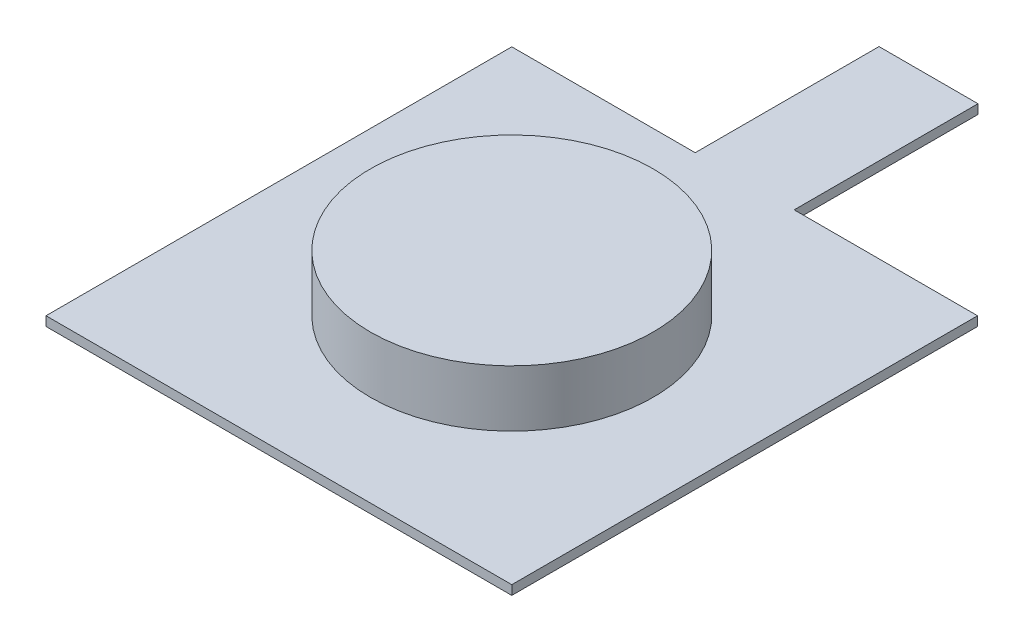
ISO-10303-21;
HEADER;
FILE_DESCRIPTION(('STEP AP214'),'2;1');
FILE_NAME('part.step','',(''),(''),'','','');
FILE_SCHEMA(('AUTOMOTIVE_DESIGN { 1 0 10303 214 1 1 1 1 }'));
ENDSEC;
DATA;
#1=APPLICATION_CONTEXT('core data for automotive mechanical design processes');
#2=APPLICATION_PROTOCOL_DEFINITION('international standard','automotive_design',2000,#1);
#3=PRODUCT_CONTEXT('',#1,'mechanical');
#4=PRODUCT('Part','Part','',(#3));
#5=PRODUCT_RELATED_PRODUCT_CATEGORY('part','',(#4));
#6=PRODUCT_DEFINITION_FORMATION('','',#4);
#7=PRODUCT_DEFINITION_CONTEXT('part definition',#1,'design');
#8=PRODUCT_DEFINITION('design','',#6,#7);
#9=PRODUCT_DEFINITION_SHAPE('','',#8);
#10=(LENGTH_UNIT() NAMED_UNIT(*) SI_UNIT(.MILLI.,.METRE.));
#11=(NAMED_UNIT(*) PLANE_ANGLE_UNIT() SI_UNIT($,.RADIAN.));
#12=(NAMED_UNIT(*) SI_UNIT($,.STERADIAN.) SOLID_ANGLE_UNIT());
#13=UNCERTAINTY_MEASURE_WITH_UNIT(LENGTH_MEASURE(1.E-05),#10,'distance_accuracy_value','');
#14=(GEOMETRIC_REPRESENTATION_CONTEXT(3) GLOBAL_UNCERTAINTY_ASSIGNED_CONTEXT((#13)) GLOBAL_UNIT_ASSIGNED_CONTEXT((#10,
#11,#12)) REPRESENTATION_CONTEXT('',''));
#15=CARTESIAN_POINT('',(0.,0.,0.));
#16=DIRECTION('',(0.,0.,1.));
#17=DIRECTION('',(1.,0.,0.));
#18=AXIS2_PLACEMENT_3D('',#15,#16,#17);
#19=CARTESIAN_POINT('',(0.,0.33,0.));
#20=DIRECTION('',(1.,0.,0.));
#21=DIRECTION('',(0.,0.,-1.));
#22=AXIS2_PLACEMENT_3D('',#19,#20,#21);
#23=PLANE('',#22);
#24=DIRECTION('',(0.,0.,1.));
#25=VECTOR('',#24,1.);
#26=CARTESIAN_POINT('',(0.,0.,0.));
#27=LINE('',#26,#25);
#28=CARTESIAN_POINT('',(0.,0.,-16.47));
#29=VERTEX_POINT('',#28);
#30=CARTESIAN_POINT('',(0.,0.,0.));
#31=VERTEX_POINT('',#30);
#32=EDGE_CURVE('E131',#29,#31,#27,.T.);
#33=ORIENTED_EDGE('',*,*,#32,.T.);
#34=DIRECTION('',(0.,-1.,0.));
#35=VECTOR('',#34,1.);
#36=CARTESIAN_POINT('',(0.,0.33,0.));
#37=LINE('',#36,#35);
#38=CARTESIAN_POINT('',(0.,0.33,0.));
#39=VERTEX_POINT('',#38);
#40=EDGE_CURVE('E36',#39,#31,#37,.T.);
#41=ORIENTED_EDGE('',*,*,#40,.F.);
#42=DIRECTION('',(0.,0.,1.));
#43=VECTOR('',#42,1.);
#44=CARTESIAN_POINT('',(0.,0.33,0.));
#45=LINE('',#44,#43);
#46=CARTESIAN_POINT('',(0.,0.33,-16.47));
#47=VERTEX_POINT('',#46);
#48=EDGE_CURVE('E146',#47,#39,#45,.T.);
#49=ORIENTED_EDGE('',*,*,#48,.F.);
#50=DIRECTION('',(0.,-1.,0.));
#51=VECTOR('',#50,1.);
#52=CARTESIAN_POINT('',(0.,0.33,-16.47));
#53=LINE('',#52,#51);
#54=EDGE_CURVE('E127',#47,#29,#53,.T.);
#55=ORIENTED_EDGE('',*,*,#54,.T.);
#56=EDGE_LOOP('',(#33,#41,#49,#55));
#57=FACE_BOUND('',#56,.T.);
#58=ADVANCED_FACE('F33',(#57),#23,.F.);
#59=CARTESIAN_POINT('',(0.,0.33,0.));
#60=DIRECTION('',(0.,0.,-1.));
#61=DIRECTION('',(-1.,0.,0.));
#62=AXIS2_PLACEMENT_3D('',#59,#60,#61);
#63=PLANE('',#62);
#64=DIRECTION('',(1.,0.,0.));
#65=VECTOR('',#64,1.);
#66=CARTESIAN_POINT('',(0.,0.,0.));
#67=LINE('',#66,#65);
#68=CARTESIAN_POINT('',(16.47,0.,0.));
#69=VERTEX_POINT('',#68);
#70=EDGE_CURVE('E134',#31,#69,#67,.T.);
#71=ORIENTED_EDGE('',*,*,#70,.T.);
#72=DIRECTION('',(0.,-1.,0.));
#73=VECTOR('',#72,1.);
#74=CARTESIAN_POINT('',(16.47,0.33,0.));
#75=LINE('',#74,#73);
#76=CARTESIAN_POINT('',(16.47,0.33,0.));
#77=VERTEX_POINT('',#76);
#78=EDGE_CURVE('E155',#77,#69,#75,.T.);
#79=ORIENTED_EDGE('',*,*,#78,.F.);
#80=DIRECTION('',(1.,0.,0.));
#81=VECTOR('',#80,1.);
#82=CARTESIAN_POINT('',(0.,0.33,0.));
#83=LINE('',#82,#81);
#84=EDGE_CURVE('E94',#39,#77,#83,.T.);
#85=ORIENTED_EDGE('',*,*,#84,.F.);
#86=ORIENTED_EDGE('',*,*,#40,.T.);
#87=EDGE_LOOP('',(#71,#79,#85,#86));
#88=FACE_BOUND('',#87,.T.);
#89=ADVANCED_FACE('F161',(#88),#63,.F.);
#90=CARTESIAN_POINT('',(16.47,0.33,0.));
#91=DIRECTION('',(-1.,0.,0.));
#92=DIRECTION('',(0.,0.,1.));
#93=AXIS2_PLACEMENT_3D('',#90,#91,#92);
#94=PLANE('',#93);
#95=DIRECTION('',(0.,0.,-1.));
#96=VECTOR('',#95,1.);
#97=CARTESIAN_POINT('',(16.47,0.,0.));
#98=LINE('',#97,#96);
#99=CARTESIAN_POINT('',(16.47,0.,-16.47));
#100=VERTEX_POINT('',#99);
#101=EDGE_CURVE('E137',#69,#100,#98,.T.);
#102=ORIENTED_EDGE('',*,*,#101,.T.);
#103=DIRECTION('',(0.,-1.,0.));
#104=VECTOR('',#103,1.);
#105=CARTESIAN_POINT('',(16.47,0.33,-16.47));
#106=LINE('',#105,#104);
#107=CARTESIAN_POINT('',(16.47,0.33,-16.47));
#108=VERTEX_POINT('',#107);
#109=EDGE_CURVE('E153',#108,#100,#106,.T.);
#110=ORIENTED_EDGE('',*,*,#109,.F.);
#111=DIRECTION('',(0.,0.,-1.));
#112=VECTOR('',#111,1.);
#113=CARTESIAN_POINT('',(16.47,0.33,0.));
#114=LINE('',#113,#112);
#115=EDGE_CURVE('E176',#77,#108,#114,.T.);
#116=ORIENTED_EDGE('',*,*,#115,.F.);
#117=ORIENTED_EDGE('',*,*,#78,.T.);
#118=EDGE_LOOP('',(#102,#110,#116,#117));
#119=FACE_BOUND('',#118,.T.);
#120=ADVANCED_FACE('F170',(#119),#94,.F.);
#121=CARTESIAN_POINT('',(9.985,0.33,-16.47));
#122=DIRECTION('',(0.,0.,1.));
#123=DIRECTION('',(1.,0.,0.));
#124=AXIS2_PLACEMENT_3D('',#121,#122,#123);
#125=PLANE('',#124);
#126=DIRECTION('',(-1.,0.,0.));
#127=VECTOR('',#126,1.);
#128=CARTESIAN_POINT('',(9.985,0.,-16.47));
#129=LINE('',#128,#127);
#130=CARTESIAN_POINT('',(9.985,0.,-16.47));
#131=VERTEX_POINT('',#130);
#132=EDGE_CURVE('E139',#100,#131,#129,.T.);
#133=ORIENTED_EDGE('',*,*,#132,.T.);
#134=DIRECTION('',(0.,-1.,0.));
#135=VECTOR('',#134,1.);
#136=CARTESIAN_POINT('',(9.985,0.33,-16.47));
#137=LINE('',#136,#135);
#138=CARTESIAN_POINT('',(9.985,0.33,-16.47));
#139=VERTEX_POINT('',#138);
#140=EDGE_CURVE('E150',#139,#131,#137,.T.);
#141=ORIENTED_EDGE('',*,*,#140,.F.);
#142=DIRECTION('',(-1.,0.,0.));
#143=VECTOR('',#142,1.);
#144=CARTESIAN_POINT('',(9.985,0.33,-16.47));
#145=LINE('',#144,#143);
#146=EDGE_CURVE('E175',#108,#139,#145,.T.);
#147=ORIENTED_EDGE('',*,*,#146,.F.);
#148=ORIENTED_EDGE('',*,*,#109,.T.);
#149=EDGE_LOOP('',(#133,#141,#147,#148));
#150=FACE_BOUND('',#149,.T.);
#151=ADVANCED_FACE('F173',(#150),#125,.F.);
#152=CARTESIAN_POINT('',(9.985,0.33,-22.97));
#153=DIRECTION('',(-1.,0.,0.));
#154=DIRECTION('',(0.,0.,1.));
#155=AXIS2_PLACEMENT_3D('',#152,#153,#154);
#156=PLANE('',#155);
#157=DIRECTION('',(0.,0.,-1.));
#158=VECTOR('',#157,1.);
#159=CARTESIAN_POINT('',(9.985,0.,-22.97));
#160=LINE('',#159,#158);
#161=CARTESIAN_POINT('',(9.985,0.,-22.97));
#162=VERTEX_POINT('',#161);
#163=EDGE_CURVE('E141',#131,#162,#160,.T.);
#164=ORIENTED_EDGE('',*,*,#163,.T.);
#165=DIRECTION('',(0.,-1.,0.));
#166=VECTOR('',#165,1.);
#167=CARTESIAN_POINT('',(9.985,0.33,-22.97));
#168=LINE('',#167,#166);
#169=CARTESIAN_POINT('',(9.985,0.33,-22.97));
#170=VERTEX_POINT('',#169);
#171=EDGE_CURVE('E122',#170,#162,#168,.T.);
#172=ORIENTED_EDGE('',*,*,#171,.F.);
#173=DIRECTION('',(0.,0.,-1.));
#174=VECTOR('',#173,1.);
#175=CARTESIAN_POINT('',(9.985,0.33,-22.97));
#176=LINE('',#175,#174);
#177=EDGE_CURVE('E113',#139,#170,#176,.T.);
#178=ORIENTED_EDGE('',*,*,#177,.F.);
#179=ORIENTED_EDGE('',*,*,#140,.T.);
#180=EDGE_LOOP('',(#164,#172,#178,#179));
#181=FACE_BOUND('',#180,.T.);
#182=ADVANCED_FACE('F213',(#181),#156,.F.);
#183=CARTESIAN_POINT('',(6.485,0.33,-22.97));
#184=DIRECTION('',(0.,0.,1.));
#185=DIRECTION('',(1.,0.,0.));
#186=AXIS2_PLACEMENT_3D('',#183,#184,#185);
#187=PLANE('',#186);
#188=DIRECTION('',(-1.,0.,0.));
#189=VECTOR('',#188,1.);
#190=CARTESIAN_POINT('',(6.485,0.,-22.97));
#191=LINE('',#190,#189);
#192=CARTESIAN_POINT('',(6.485,0.,-22.97));
#193=VERTEX_POINT('',#192);
#194=EDGE_CURVE('E121',#162,#193,#191,.T.);
#195=ORIENTED_EDGE('',*,*,#194,.T.);
#196=DIRECTION('',(0.,-1.,0.));
#197=VECTOR('',#196,1.);
#198=CARTESIAN_POINT('',(6.485,0.33,-22.97));
#199=LINE('',#198,#197);
#200=CARTESIAN_POINT('',(6.485,0.33,-22.97));
#201=VERTEX_POINT('',#200);
#202=EDGE_CURVE('E118',#201,#193,#199,.T.);
#203=ORIENTED_EDGE('',*,*,#202,.F.);
#204=DIRECTION('',(-1.,0.,0.));
#205=VECTOR('',#204,1.);
#206=CARTESIAN_POINT('',(6.485,0.33,-22.97));
#207=LINE('',#206,#205);
#208=EDGE_CURVE('E107',#170,#201,#207,.T.);
#209=ORIENTED_EDGE('',*,*,#208,.F.);
#210=ORIENTED_EDGE('',*,*,#171,.T.);
#211=EDGE_LOOP('',(#195,#203,#209,#210));
#212=FACE_BOUND('',#211,.T.);
#213=ADVANCED_FACE('F119',(#212),#187,.F.);
#214=CARTESIAN_POINT('',(6.485,0.33,-16.47));
#215=DIRECTION('',(1.,0.,0.));
#216=DIRECTION('',(0.,0.,-1.));
#217=AXIS2_PLACEMENT_3D('',#214,#215,#216);
#218=PLANE('',#217);
#219=DIRECTION('',(0.,0.,1.));
#220=VECTOR('',#219,1.);
#221=CARTESIAN_POINT('',(6.485,0.,-16.47));
#222=LINE('',#221,#220);
#223=CARTESIAN_POINT('',(6.485,0.,-16.47));
#224=VERTEX_POINT('',#223);
#225=EDGE_CURVE('E79',#193,#224,#222,.T.);
#226=ORIENTED_EDGE('',*,*,#225,.T.);
#227=DIRECTION('',(0.,-1.,0.));
#228=VECTOR('',#227,1.);
#229=CARTESIAN_POINT('',(6.485,0.33,-16.47));
#230=LINE('',#229,#228);
#231=CARTESIAN_POINT('',(6.485,0.33,-16.47));
#232=VERTEX_POINT('',#231);
#233=EDGE_CURVE('E123',#232,#224,#230,.T.);
#234=ORIENTED_EDGE('',*,*,#233,.F.);
#235=DIRECTION('',(0.,0.,1.));
#236=VECTOR('',#235,1.);
#237=CARTESIAN_POINT('',(6.485,0.33,-16.47));
#238=LINE('',#237,#236);
#239=EDGE_CURVE('E111',#201,#232,#238,.T.);
#240=ORIENTED_EDGE('',*,*,#239,.F.);
#241=ORIENTED_EDGE('',*,*,#202,.T.);
#242=EDGE_LOOP('',(#226,#234,#240,#241));
#243=FACE_BOUND('',#242,.T.);
#244=ADVANCED_FACE('F125',(#243),#218,.F.);
#245=CARTESIAN_POINT('',(6.485,0.33,-16.47));
#246=DIRECTION('',(0.,0.,1.));
#247=DIRECTION('',(1.,0.,0.));
#248=AXIS2_PLACEMENT_3D('',#245,#246,#247);
#249=PLANE('',#248);
#250=DIRECTION('',(-1.,0.,0.));
#251=VECTOR('',#250,1.);
#252=CARTESIAN_POINT('',(6.485,0.,-16.47));
#253=LINE('',#252,#251);
#254=EDGE_CURVE('E85',#224,#29,#253,.T.);
#255=ORIENTED_EDGE('',*,*,#254,.T.);
#256=ORIENTED_EDGE('',*,*,#54,.F.);
#257=DIRECTION('',(-1.,0.,0.));
#258=VECTOR('',#257,1.);
#259=CARTESIAN_POINT('',(6.485,0.33,-16.47));
#260=LINE('',#259,#258);
#261=EDGE_CURVE('E50',#232,#47,#260,.T.);
#262=ORIENTED_EDGE('',*,*,#261,.F.);
#263=ORIENTED_EDGE('',*,*,#233,.T.);
#264=EDGE_LOOP('',(#255,#256,#262,#263));
#265=FACE_BOUND('',#264,.T.);
#266=ADVANCED_FACE('F194',(#265),#249,.F.);
#267=CARTESIAN_POINT('',(0.,0.33,0.));
#268=DIRECTION('',(0.,1.,0.));
#269=DIRECTION('',(0.,0.,1.));
#270=AXIS2_PLACEMENT_3D('',#267,#268,#269);
#271=PLANE('',#270);
#272=CARTESIAN_POINT('',(8.235,0.33,-8.235));
#273=DIRECTION('',(0.,1.,0.));
#274=DIRECTION('',(0.,0.,1.));
#275=AXIS2_PLACEMENT_3D('',#272,#273,#274);
#276=CIRCLE('',#275,5.);
#277=CARTESIAN_POINT('',(8.235,0.33,-3.235));
#278=VERTEX_POINT('',#277);
#279=EDGE_CURVE('E11',#278,#278,#276,.T.);
#280=ORIENTED_EDGE('',*,*,#279,.F.);
#281=EDGE_LOOP('',(#280));
#282=FACE_BOUND('',#281,.T.);
#283=ORIENTED_EDGE('',*,*,#48,.T.);
#284=ORIENTED_EDGE('',*,*,#84,.T.);
#285=ORIENTED_EDGE('',*,*,#115,.T.);
#286=ORIENTED_EDGE('',*,*,#146,.T.);
#287=ORIENTED_EDGE('',*,*,#177,.T.);
#288=ORIENTED_EDGE('',*,*,#208,.T.);
#289=ORIENTED_EDGE('',*,*,#239,.T.);
#290=ORIENTED_EDGE('',*,*,#261,.T.);
#291=EDGE_LOOP('',(#283,#284,#285,#286,#287,#288,#289,#290));
#292=FACE_BOUND('',#291,.T.);
#293=ADVANCED_FACE('F109',(#282,#292),#271,.T.);
#294=CARTESIAN_POINT('',(0.,0.,0.));
#295=DIRECTION('',(0.,1.,0.));
#296=DIRECTION('',(0.,0.,1.));
#297=AXIS2_PLACEMENT_3D('',#294,#295,#296);
#298=PLANE('',#297);
#299=ORIENTED_EDGE('',*,*,#32,.F.);
#300=ORIENTED_EDGE('',*,*,#254,.F.);
#301=ORIENTED_EDGE('',*,*,#225,.F.);
#302=ORIENTED_EDGE('',*,*,#194,.F.);
#303=ORIENTED_EDGE('',*,*,#163,.F.);
#304=ORIENTED_EDGE('',*,*,#132,.F.);
#305=ORIENTED_EDGE('',*,*,#101,.F.);
#306=ORIENTED_EDGE('',*,*,#70,.F.);
#307=EDGE_LOOP('',(#299,#300,#301,#302,#303,#304,#305,#306));
#308=FACE_BOUND('',#307,.T.);
#309=ADVANCED_FACE('F166',(#308),#298,.F.);
#310=CARTESIAN_POINT('',(8.235,2.33,-8.235));
#311=DIRECTION('',(0.,-1.,0.));
#312=DIRECTION('',(0.,0.,-1.));
#313=AXIS2_PLACEMENT_3D('',#310,#311,#312);
#314=CYLINDRICAL_SURFACE('',#313,5.);
#315=CARTESIAN_POINT('',(8.235,2.33,-8.235));
#316=DIRECTION('',(0.,1.,0.));
#317=DIRECTION('',(0.,0.,1.));
#318=AXIS2_PLACEMENT_3D('',#315,#316,#317);
#319=CIRCLE('',#318,5.);
#320=CARTESIAN_POINT('',(8.235,2.33,-3.235));
#321=VERTEX_POINT('',#320);
#322=EDGE_CURVE('E135',#321,#321,#319,.T.);
#323=ORIENTED_EDGE('',*,*,#322,.F.);
#324=EDGE_LOOP('',(#323));
#325=FACE_BOUND('',#324,.T.);
#326=ORIENTED_EDGE('',*,*,#279,.T.);
#327=EDGE_LOOP('',(#326));
#328=FACE_BOUND('',#327,.T.);
#329=ADVANCED_FACE('F187',(#325,#328),#314,.T.);
#330=CARTESIAN_POINT('',(8.235,2.33,-8.235));
#331=DIRECTION('',(0.,1.,0.));
#332=DIRECTION('',(0.,0.,1.));
#333=AXIS2_PLACEMENT_3D('',#330,#331,#332);
#334=PLANE('',#333);
#335=ORIENTED_EDGE('',*,*,#322,.T.);
#336=EDGE_LOOP('',(#335));
#337=FACE_BOUND('',#336,.T.);
#338=ADVANCED_FACE('F185',(#337),#334,.T.);
#339=CLOSED_SHELL('',(#58,#89,#120,#151,#182,#213,#244,#266,#293,#309,#329,#338));
#340=MANIFOLD_SOLID_BREP('B2',#339);
#341=ADVANCED_BREP_SHAPE_REPRESENTATION('',(#18,#340),#14);
#342=SHAPE_DEFINITION_REPRESENTATION(#9,#341);
ENDSEC;
END-ISO-10303-21;
